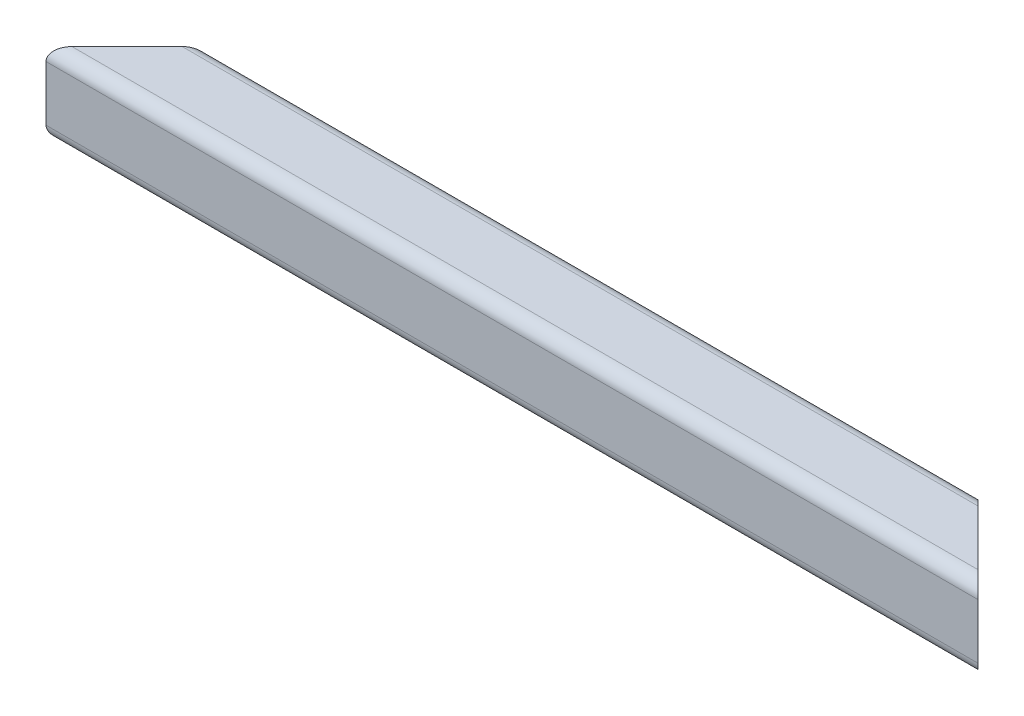
ISO-10303-21;
HEADER;
FILE_DESCRIPTION(('STEP AP214'),'2;1');
FILE_NAME('part.step','',(''),(''),'','','');
FILE_SCHEMA(('AUTOMOTIVE_DESIGN { 1 0 10303 214 1 1 1 1 }'));
ENDSEC;
DATA;
#1=APPLICATION_CONTEXT('core data for automotive mechanical design processes');
#2=APPLICATION_PROTOCOL_DEFINITION('international standard','automotive_design',2000,#1);
#3=PRODUCT_CONTEXT('',#1,'mechanical');
#4=PRODUCT('Part','Part','',(#3));
#5=PRODUCT_RELATED_PRODUCT_CATEGORY('part','',(#4));
#6=PRODUCT_DEFINITION_FORMATION('','',#4);
#7=PRODUCT_DEFINITION_CONTEXT('part definition',#1,'design');
#8=PRODUCT_DEFINITION('design','',#6,#7);
#9=PRODUCT_DEFINITION_SHAPE('','',#8);
#10=(LENGTH_UNIT() NAMED_UNIT(*) SI_UNIT(.MILLI.,.METRE.));
#11=(NAMED_UNIT(*) PLANE_ANGLE_UNIT() SI_UNIT($,.RADIAN.));
#12=(NAMED_UNIT(*) SI_UNIT($,.STERADIAN.) SOLID_ANGLE_UNIT());
#13=UNCERTAINTY_MEASURE_WITH_UNIT(LENGTH_MEASURE(1.E-05),#10,'distance_accuracy_value','');
#14=(GEOMETRIC_REPRESENTATION_CONTEXT(3) GLOBAL_UNCERTAINTY_ASSIGNED_CONTEXT((#13)) GLOBAL_UNIT_ASSIGNED_CONTEXT((#10,
#11,#12)) REPRESENTATION_CONTEXT('',''));
#15=CARTESIAN_POINT('',(0.,0.,0.));
#16=DIRECTION('',(0.,0.,1.));
#17=DIRECTION('',(1.,0.,0.));
#18=AXIS2_PLACEMENT_3D('',#15,#16,#17);
#19=CARTESIAN_POINT('',(460.,13.6,-20.));
#20=DIRECTION('',(0.,0.,1.));
#21=DIRECTION('',(1.,0.,0.));
#22=AXIS2_PLACEMENT_3D('',#19,#20,#21);
#23=PLANE('',#22);
#24=DIRECTION('',(-1.,0.,0.));
#25=VECTOR('',#24,1.);
#26=CARTESIAN_POINT('',(460.,-13.6,-20.));
#27=LINE('',#26,#25);
#28=CARTESIAN_POINT('',(420.,-13.6,-20.0000000000001));
#29=VERTEX_POINT('',#28);
#30=CARTESIAN_POINT('',(40.,-13.6,-20.));
#31=VERTEX_POINT('',#30);
#32=EDGE_CURVE('E348',#29,#31,#27,.T.);
#33=ORIENTED_EDGE('',*,*,#32,.T.);
#34=DIRECTION('',(0.,1.,0.));
#35=VECTOR('',#34,1.);
#36=CARTESIAN_POINT('',(40.,-20.,-20.));
#37=LINE('',#36,#35);
#38=CARTESIAN_POINT('',(40.,13.6,-20.));
#39=VERTEX_POINT('',#38);
#40=EDGE_CURVE('E235',#31,#39,#37,.T.);
#41=ORIENTED_EDGE('',*,*,#40,.T.);
#42=DIRECTION('',(-1.,0.,0.));
#43=VECTOR('',#42,1.);
#44=CARTESIAN_POINT('',(460.,13.6,-20.));
#45=LINE('',#44,#43);
#46=CARTESIAN_POINT('',(420.,13.6,-20.0000000000001));
#47=VERTEX_POINT('',#46);
#48=EDGE_CURVE('E344',#47,#39,#45,.T.);
#49=ORIENTED_EDGE('',*,*,#48,.F.);
#50=DIRECTION('',(0.,1.,0.));
#51=VECTOR('',#50,1.);
#52=CARTESIAN_POINT('',(420.,-20.,-20.0000000000001));
#53=LINE('',#52,#51);
#54=EDGE_CURVE('E236',#29,#47,#53,.T.);
#55=ORIENTED_EDGE('',*,*,#54,.F.);
#56=EDGE_LOOP('',(#33,#41,#49,#55));
#57=FACE_BOUND('',#56,.T.);
#58=ADVANCED_FACE('F69',(#57),#23,.F.);
#59=CARTESIAN_POINT('',(460.,-13.6,-13.6));
#60=DIRECTION('',(-1.,0.,0.));
#61=DIRECTION('',(0.,0.,1.));
#62=AXIS2_PLACEMENT_3D('',#59,#60,#61);
#63=CYLINDRICAL_SURFACE('',#62,6.4);
#64=DIRECTION('',(-1.,0.,0.));
#65=VECTOR('',#64,1.);
#66=CARTESIAN_POINT('',(460.,-20.,-13.6));
#67=LINE('',#66,#65);
#68=CARTESIAN_POINT('',(426.4,-20.,-13.6));
#69=VERTEX_POINT('',#68);
#70=CARTESIAN_POINT('',(33.6,-20.,-13.6));
#71=VERTEX_POINT('',#70);
#72=EDGE_CURVE('E353',#69,#71,#67,.T.);
#73=ORIENTED_EDGE('',*,*,#72,.T.);
#74=CARTESIAN_POINT('',(33.6000000000001,-13.6,-13.6));
#75=DIRECTION('',(0.707106781186547,0.,0.707106781186548));
#76=DIRECTION('',(-0.707106781186548,0.,0.707106781186547));
#77=AXIS2_PLACEMENT_3D('',#74,#75,#76);
#78=ELLIPSE('',#77,9.05096679918782,6.4);
#79=EDGE_CURVE('E228',#71,#31,#78,.T.);
#80=ORIENTED_EDGE('',*,*,#79,.T.);
#81=ORIENTED_EDGE('',*,*,#32,.F.);
#82=CARTESIAN_POINT('',(426.4,-13.6,-13.6));
#83=DIRECTION('',(-0.70710678118655,0.,0.707106781186545));
#84=DIRECTION('',(-0.707106781186545,0.,-0.70710678118655));
#85=AXIS2_PLACEMENT_3D('',#82,#83,#84);
#86=ELLIPSE('',#85,9.05096679918778,6.4);
#87=EDGE_CURVE('E320',#29,#69,#86,.T.);
#88=ORIENTED_EDGE('',*,*,#87,.T.);
#89=EDGE_LOOP('',(#73,#80,#81,#88));
#90=FACE_BOUND('',#89,.T.);
#91=ADVANCED_FACE('F451',(#90),#63,.T.);
#92=CARTESIAN_POINT('',(460.,-20.,13.6));
#93=DIRECTION('',(0.,1.,0.));
#94=DIRECTION('',(0.,0.,1.));
#95=AXIS2_PLACEMENT_3D('',#92,#93,#94);
#96=PLANE('',#95);
#97=CARTESIAN_POINT('',(230.,-20.,0.));
#98=DIRECTION('',(0.,1.,0.));
#99=DIRECTION('',(0.,0.,1.));
#100=AXIS2_PLACEMENT_3D('',#97,#98,#99);
#101=CIRCLE('',#100,2.);
#102=CARTESIAN_POINT('',(230.,-20.,2.));
#103=VERTEX_POINT('',#102);
#104=EDGE_CURVE('E224',#103,#103,#101,.T.);
#105=ORIENTED_EDGE('',*,*,#104,.T.);
#106=EDGE_LOOP('',(#105));
#107=FACE_BOUND('',#106,.T.);
#108=DIRECTION('',(0.707106781186545,0.,0.70710678118655));
#109=VECTOR('',#108,1.);
#110=CARTESIAN_POINT('',(420.,-20.,-20.0000000000001));
#111=LINE('',#110,#109);
#112=CARTESIAN_POINT('',(438.585786437627,-20.,-1.41421356237311));
#113=VERTEX_POINT('',#112);
#114=EDGE_CURVE('E246',#69,#113,#111,.T.);
#115=ORIENTED_EDGE('',*,*,#114,.T.);
#116=CARTESIAN_POINT('',(440.,-20.,0.));
#117=DIRECTION('',(0.,1.,0.));
#118=DIRECTION('',(0.,0.,1.));
#119=AXIS2_PLACEMENT_3D('',#116,#117,#118);
#120=CIRCLE('',#119,2.);
#121=CARTESIAN_POINT('',(441.414213562373,-20.,1.41421356237308));
#122=VERTEX_POINT('',#121);
#123=EDGE_CURVE('E416',#113,#122,#120,.T.);
#124=ORIENTED_EDGE('',*,*,#123,.T.);
#125=CARTESIAN_POINT('',(453.6,-20.,13.6));
#126=VERTEX_POINT('',#125);
#127=EDGE_CURVE('E249',#122,#126,#111,.T.);
#128=ORIENTED_EDGE('',*,*,#127,.T.);
#129=DIRECTION('',(-1.,0.,0.));
#130=VECTOR('',#129,1.);
#131=CARTESIAN_POINT('',(460.,-20.,13.6));
#132=LINE('',#131,#130);
#133=CARTESIAN_POINT('',(6.4,-20.,13.6));
#134=VERTEX_POINT('',#133);
#135=EDGE_CURVE('E356',#126,#134,#132,.T.);
#136=ORIENTED_EDGE('',*,*,#135,.T.);
#137=DIRECTION('',(0.707106781186548,0.,-0.707106781186547));
#138=VECTOR('',#137,1.);
#139=CARTESIAN_POINT('',(40.,-20.,-20.));
#140=LINE('',#139,#138);
#141=CARTESIAN_POINT('',(18.5857864376269,-20.,1.41421356237311));
#142=VERTEX_POINT('',#141);
#143=EDGE_CURVE('E222',#134,#142,#140,.T.);
#144=ORIENTED_EDGE('',*,*,#143,.T.);
#145=CARTESIAN_POINT('',(20.,-20.,0.));
#146=DIRECTION('',(0.,1.,0.));
#147=DIRECTION('',(0.,0.,1.));
#148=AXIS2_PLACEMENT_3D('',#145,#146,#147);
#149=CIRCLE('',#148,2.);
#150=CARTESIAN_POINT('',(21.4142135623731,-20.,-1.41421356237308));
#151=VERTEX_POINT('',#150);
#152=EDGE_CURVE('E207',#142,#151,#149,.T.);
#153=ORIENTED_EDGE('',*,*,#152,.T.);
#154=EDGE_CURVE('E219',#151,#71,#140,.T.);
#155=ORIENTED_EDGE('',*,*,#154,.T.);
#156=ORIENTED_EDGE('',*,*,#72,.F.);
#157=EDGE_LOOP('',(#115,#124,#128,#136,#144,#153,#155,#156));
#158=FACE_BOUND('',#157,.T.);
#159=ADVANCED_FACE('F217',(#107,#158),#96,.F.);
#160=CARTESIAN_POINT('',(460.,-13.6,20.));
#161=DIRECTION('',(0.,0.,-1.));
#162=DIRECTION('',(0.,1.,0.));
#163=AXIS2_PLACEMENT_3D('',#160,#161,#162);
#164=PLANE('',#163);
#165=DIRECTION('',(0.,-1.,0.));
#166=VECTOR('',#165,1.);
#167=CARTESIAN_POINT('',(0.,-13.6,20.));
#168=LINE('',#167,#166);
#169=CARTESIAN_POINT('',(0.,13.6,20.));
#170=VERTEX_POINT('',#169);
#171=CARTESIAN_POINT('',(0.,-13.6,20.));
#172=VERTEX_POINT('',#171);
#173=EDGE_CURVE('E336',#170,#172,#168,.T.);
#174=ORIENTED_EDGE('',*,*,#173,.T.);
#175=DIRECTION('',(-1.,0.,0.));
#176=VECTOR('',#175,1.);
#177=CARTESIAN_POINT('',(460.,-13.6,20.));
#178=LINE('',#177,#176);
#179=CARTESIAN_POINT('',(460.,-13.6,20.0000000000002));
#180=VERTEX_POINT('',#179);
#181=EDGE_CURVE('E359',#180,#172,#178,.T.);
#182=ORIENTED_EDGE('',*,*,#181,.F.);
#183=DIRECTION('',(0.,-1.,0.));
#184=VECTOR('',#183,1.);
#185=CARTESIAN_POINT('',(460.,-13.6,20.));
#186=LINE('',#185,#184);
#187=CARTESIAN_POINT('',(460.,13.6,20.));
#188=VERTEX_POINT('',#187);
#189=EDGE_CURVE('E337',#188,#180,#186,.T.);
#190=ORIENTED_EDGE('',*,*,#189,.F.);
#191=DIRECTION('',(-1.,0.,0.));
#192=VECTOR('',#191,1.);
#193=CARTESIAN_POINT('',(460.,13.6,20.));
#194=LINE('',#193,#192);
#195=EDGE_CURVE('E363',#188,#170,#194,.T.);
#196=ORIENTED_EDGE('',*,*,#195,.T.);
#197=EDGE_LOOP('',(#174,#182,#190,#196));
#198=FACE_BOUND('',#197,.T.);
#199=ADVANCED_FACE('F434',(#198),#164,.F.);
#200=CARTESIAN_POINT('',(460.,-13.6,13.6));
#201=DIRECTION('',(-1.,0.,0.));
#202=DIRECTION('',(0.,0.,1.));
#203=AXIS2_PLACEMENT_3D('',#200,#201,#202);
#204=CYLINDRICAL_SURFACE('',#203,6.4);
#205=ORIENTED_EDGE('',*,*,#181,.T.);
#206=CARTESIAN_POINT('',(6.40000000000007,-13.6,13.6));
#207=DIRECTION('',(0.707106781186547,0.,0.707106781186548));
#208=DIRECTION('',(-0.707106781186548,0.,0.707106781186547));
#209=AXIS2_PLACEMENT_3D('',#206,#207,#208);
#210=ELLIPSE('',#209,9.05096679918781,6.4);
#211=EDGE_CURVE('E282',#172,#134,#210,.T.);
#212=ORIENTED_EDGE('',*,*,#211,.T.);
#213=ORIENTED_EDGE('',*,*,#135,.F.);
#214=CARTESIAN_POINT('',(453.6,-13.6,13.6));
#215=DIRECTION('',(-0.70710678118655,0.,0.707106781186545));
#216=DIRECTION('',(-0.707106781186545,0.,-0.70710678118655));
#217=AXIS2_PLACEMENT_3D('',#214,#215,#216);
#218=ELLIPSE('',#217,9.05096679918778,6.4);
#219=EDGE_CURVE('E324',#126,#180,#218,.T.);
#220=ORIENTED_EDGE('',*,*,#219,.T.);
#221=EDGE_LOOP('',(#205,#212,#213,#220));
#222=FACE_BOUND('',#221,.T.);
#223=ADVANCED_FACE('F432',(#222),#204,.T.);
#224=CARTESIAN_POINT('',(460.,13.6,13.6));
#225=DIRECTION('',(-1.,0.,0.));
#226=DIRECTION('',(0.,0.,1.));
#227=AXIS2_PLACEMENT_3D('',#224,#225,#226);
#228=CYLINDRICAL_SURFACE('',#227,6.4);
#229=DIRECTION('',(-1.,0.,0.));
#230=VECTOR('',#229,1.);
#231=CARTESIAN_POINT('',(460.,20.,13.6));
#232=LINE('',#231,#230);
#233=CARTESIAN_POINT('',(453.6,20.,13.6));
#234=VERTEX_POINT('',#233);
#235=CARTESIAN_POINT('',(6.40000000000001,20.,13.6));
#236=VERTEX_POINT('',#235);
#237=EDGE_CURVE('E367',#234,#236,#232,.T.);
#238=ORIENTED_EDGE('',*,*,#237,.T.);
#239=CARTESIAN_POINT('',(6.40000000000007,13.6,13.6));
#240=DIRECTION('',(0.707106781186547,0.,0.707106781186548));
#241=DIRECTION('',(-0.707106781186548,0.,0.707106781186547));
#242=AXIS2_PLACEMENT_3D('',#239,#240,#241);
#243=ELLIPSE('',#242,9.05096679918782,6.4);
#244=EDGE_CURVE('E286',#236,#170,#243,.T.);
#245=ORIENTED_EDGE('',*,*,#244,.T.);
#246=ORIENTED_EDGE('',*,*,#195,.F.);
#247=CARTESIAN_POINT('',(453.6,13.6,13.6));
#248=DIRECTION('',(-0.70710678118655,0.,0.707106781186545));
#249=DIRECTION('',(-0.707106781186545,0.,-0.70710678118655));
#250=AXIS2_PLACEMENT_3D('',#247,#248,#249);
#251=ELLIPSE('',#250,9.05096679918778,6.4);
#252=EDGE_CURVE('E328',#188,#234,#251,.T.);
#253=ORIENTED_EDGE('',*,*,#252,.T.);
#254=EDGE_LOOP('',(#238,#245,#246,#253));
#255=FACE_BOUND('',#254,.T.);
#256=ADVANCED_FACE('F437',(#255),#228,.T.);
#257=CARTESIAN_POINT('',(460.,20.,-13.6));
#258=DIRECTION('',(0.,-1.,0.));
#259=DIRECTION('',(0.,0.,-1.));
#260=AXIS2_PLACEMENT_3D('',#257,#258,#259);
#261=PLANE('',#260);
#262=DIRECTION('',(-1.,0.,0.));
#263=VECTOR('',#262,1.);
#264=CARTESIAN_POINT('',(460.,20.,-13.6));
#265=LINE('',#264,#263);
#266=CARTESIAN_POINT('',(426.4,20.,-13.6));
#267=VERTEX_POINT('',#266);
#268=CARTESIAN_POINT('',(33.6,20.,-13.6));
#269=VERTEX_POINT('',#268);
#270=EDGE_CURVE('E371',#267,#269,#265,.T.);
#271=ORIENTED_EDGE('',*,*,#270,.T.);
#272=DIRECTION('',(0.707106781186548,0.,-0.707106781186547));
#273=VECTOR('',#272,1.);
#274=CARTESIAN_POINT('',(40.,20.,-20.));
#275=LINE('',#274,#273);
#276=EDGE_CURVE('E231',#236,#269,#275,.T.);
#277=ORIENTED_EDGE('',*,*,#276,.F.);
#278=ORIENTED_EDGE('',*,*,#237,.F.);
#279=DIRECTION('',(0.707106781186545,0.,0.70710678118655));
#280=VECTOR('',#279,1.);
#281=CARTESIAN_POINT('',(420.,20.,-20.0000000000001));
#282=LINE('',#281,#280);
#283=EDGE_CURVE('E250',#267,#234,#282,.T.);
#284=ORIENTED_EDGE('',*,*,#283,.F.);
#285=EDGE_LOOP('',(#271,#277,#278,#284));
#286=FACE_BOUND('',#285,.T.);
#287=ADVANCED_FACE('F441',(#286),#261,.F.);
#288=CARTESIAN_POINT('',(460.,13.6,-13.6));
#289=DIRECTION('',(-1.,0.,0.));
#290=DIRECTION('',(0.,0.,1.));
#291=AXIS2_PLACEMENT_3D('',#288,#289,#290);
#292=CYLINDRICAL_SURFACE('',#291,6.4);
#293=ORIENTED_EDGE('',*,*,#48,.T.);
#294=CARTESIAN_POINT('',(33.6000000000001,13.6,-13.6));
#295=DIRECTION('',(0.707106781186547,0.,0.707106781186548));
#296=DIRECTION('',(-0.707106781186548,0.,0.707106781186547));
#297=AXIS2_PLACEMENT_3D('',#294,#295,#296);
#298=ELLIPSE('',#297,9.05096679918782,6.4);
#299=EDGE_CURVE('E290',#39,#269,#298,.T.);
#300=ORIENTED_EDGE('',*,*,#299,.T.);
#301=ORIENTED_EDGE('',*,*,#270,.F.);
#302=CARTESIAN_POINT('',(426.4,13.6,-13.6));
#303=DIRECTION('',(-0.70710678118655,0.,0.707106781186545));
#304=DIRECTION('',(-0.707106781186545,0.,-0.70710678118655));
#305=AXIS2_PLACEMENT_3D('',#302,#303,#304);
#306=ELLIPSE('',#305,9.05096679918778,6.4);
#307=EDGE_CURVE('E332',#267,#47,#306,.T.);
#308=ORIENTED_EDGE('',*,*,#307,.T.);
#309=EDGE_LOOP('',(#293,#300,#301,#308));
#310=FACE_BOUND('',#309,.T.);
#311=ADVANCED_FACE('F445',(#310),#292,.T.);
#312=CARTESIAN_POINT('',(40.,-20.,-20.));
#313=DIRECTION('',(0.707106781186547,0.,0.707106781186548));
#314=DIRECTION('',(0.707106781186548,0.,-0.707106781186547));
#315=AXIS2_PLACEMENT_3D('',#312,#313,#314);
#316=PLANE('',#315);
#317=ORIENTED_EDGE('',*,*,#154,.F.);
#318=DIRECTION('',(0.,1.,0.));
#319=VECTOR('',#318,1.);
#320=CARTESIAN_POINT('',(21.4142135623731,-20.,-1.41421356237308));
#321=LINE('',#320,#319);
#322=CARTESIAN_POINT('',(21.4142135623731,-16.8,-1.41421356237308));
#323=VERTEX_POINT('',#322);
#324=EDGE_CURVE('E204',#151,#323,#321,.T.);
#325=ORIENTED_EDGE('',*,*,#324,.T.);
#326=DIRECTION('',(0.707106781186548,0.,-0.707106781186547));
#327=VECTOR('',#326,1.);
#328=CARTESIAN_POINT('',(233.2,-16.8,-213.2));
#329=LINE('',#328,#327);
#330=CARTESIAN_POINT('',(33.6,-16.8,-13.6));
#331=VERTEX_POINT('',#330);
#332=EDGE_CURVE('E260',#323,#331,#329,.T.);
#333=ORIENTED_EDGE('',*,*,#332,.T.);
#334=CARTESIAN_POINT('',(33.6000000000001,-13.6,-13.6));
#335=DIRECTION('',(0.707106781186547,0.,0.707106781186548));
#336=DIRECTION('',(-0.707106781186548,0.,0.707106781186547));
#337=AXIS2_PLACEMENT_3D('',#334,#335,#336);
#338=ELLIPSE('',#337,4.5254833995939,3.2);
#339=CARTESIAN_POINT('',(36.8000000000001,-13.6,-16.8));
#340=VERTEX_POINT('',#339);
#341=EDGE_CURVE('E265',#331,#340,#338,.T.);
#342=ORIENTED_EDGE('',*,*,#341,.T.);
#343=DIRECTION('',(0.,1.,0.));
#344=VECTOR('',#343,1.);
#345=CARTESIAN_POINT('',(36.8000000000001,13.6000000000001,-16.8));
#346=LINE('',#345,#344);
#347=CARTESIAN_POINT('',(36.8000000000001,13.6,-16.8));
#348=VERTEX_POINT('',#347);
#349=EDGE_CURVE('E268',#340,#348,#346,.T.);
#350=ORIENTED_EDGE('',*,*,#349,.T.);
#351=CARTESIAN_POINT('',(33.6000000000001,13.6,-13.6));
#352=DIRECTION('',(0.707106781186547,0.,0.707106781186548));
#353=DIRECTION('',(-0.707106781186548,0.,0.707106781186547));
#354=AXIS2_PLACEMENT_3D('',#351,#352,#353);
#355=ELLIPSE('',#354,4.5254833995939,3.2);
#356=CARTESIAN_POINT('',(33.6000000000001,16.8,-13.6));
#357=VERTEX_POINT('',#356);
#358=EDGE_CURVE('E271',#348,#357,#355,.T.);
#359=ORIENTED_EDGE('',*,*,#358,.T.);
#360=DIRECTION('',(-0.707106781186548,0.,0.707106781186547));
#361=VECTOR('',#360,1.);
#362=CARTESIAN_POINT('',(246.8,16.8,-226.8));
#363=LINE('',#362,#361);
#364=CARTESIAN_POINT('',(6.40000000000002,16.8,13.6));
#365=VERTEX_POINT('',#364);
#366=EDGE_CURVE('E274',#357,#365,#363,.T.);
#367=ORIENTED_EDGE('',*,*,#366,.T.);
#368=CARTESIAN_POINT('',(6.40000000000007,13.6,13.6));
#369=DIRECTION('',(0.707106781186547,0.,0.707106781186548));
#370=DIRECTION('',(-0.707106781186548,0.,0.707106781186547));
#371=AXIS2_PLACEMENT_3D('',#368,#369,#370);
#372=ELLIPSE('',#371,4.52548339959391,3.2);
#373=CARTESIAN_POINT('',(3.20000000000004,13.6,16.8));
#374=VERTEX_POINT('',#373);
#375=EDGE_CURVE('E277',#365,#374,#372,.T.);
#376=ORIENTED_EDGE('',*,*,#375,.T.);
#377=DIRECTION('',(0.,-1.,0.));
#378=VECTOR('',#377,1.);
#379=CARTESIAN_POINT('',(3.20000000000004,-13.6000000000001,16.8));
#380=LINE('',#379,#378);
#381=CARTESIAN_POINT('',(3.20000000000004,-13.6,16.8));
#382=VERTEX_POINT('',#381);
#383=EDGE_CURVE('E245',#374,#382,#380,.T.);
#384=ORIENTED_EDGE('',*,*,#383,.T.);
#385=CARTESIAN_POINT('',(6.40000000000007,-13.6,13.6));
#386=DIRECTION('',(0.707106781186547,0.,0.707106781186548));
#387=DIRECTION('',(-0.707106781186548,0.,0.707106781186547));
#388=AXIS2_PLACEMENT_3D('',#385,#386,#387);
#389=ELLIPSE('',#388,4.5254833995939,3.2);
#390=CARTESIAN_POINT('',(6.40000000000007,-16.8,13.6));
#391=VERTEX_POINT('',#390);
#392=EDGE_CURVE('E257',#382,#391,#389,.T.);
#393=ORIENTED_EDGE('',*,*,#392,.T.);
#394=CARTESIAN_POINT('',(18.5857864376269,-16.8,1.41421356237311));
#395=VERTEX_POINT('',#394);
#396=EDGE_CURVE('E261',#391,#395,#329,.T.);
#397=ORIENTED_EDGE('',*,*,#396,.T.);
#398=DIRECTION('',(0.,1.,0.));
#399=VECTOR('',#398,1.);
#400=CARTESIAN_POINT('',(18.5857864376269,-20.,1.41421356237311));
#401=LINE('',#400,#399);
#402=EDGE_CURVE('E92',#395,#142,#401,.F.);
#403=ORIENTED_EDGE('',*,*,#402,.T.);
#404=ORIENTED_EDGE('',*,*,#143,.F.);
#405=ORIENTED_EDGE('',*,*,#211,.F.);
#406=ORIENTED_EDGE('',*,*,#173,.F.);
#407=ORIENTED_EDGE('',*,*,#244,.F.);
#408=ORIENTED_EDGE('',*,*,#276,.T.);
#409=ORIENTED_EDGE('',*,*,#299,.F.);
#410=ORIENTED_EDGE('',*,*,#40,.F.);
#411=ORIENTED_EDGE('',*,*,#79,.F.);
#412=EDGE_LOOP('',(#317,#325,#333,#342,#350,#359,#367,#376,#384,#393,#397,#403,#404,#405,#406,
#407,#408,#409,#410,#411));
#413=FACE_BOUND('',#412,.T.);
#414=ADVANCED_FACE('F226',(#413),#316,.F.);
#415=CARTESIAN_POINT('',(420.,-20.,-20.0000000000001));
#416=DIRECTION('',(-0.70710678118655,0.,0.707106781186545));
#417=DIRECTION('',(0.707106781186545,0.,0.70710678118655));
#418=AXIS2_PLACEMENT_3D('',#415,#416,#417);
#419=PLANE('',#418);
#420=ORIENTED_EDGE('',*,*,#127,.F.);
#421=DIRECTION('',(0.,1.,0.));
#422=VECTOR('',#421,1.);
#423=CARTESIAN_POINT('',(441.414213562373,-20.,1.41421356237308));
#424=LINE('',#423,#422);
#425=CARTESIAN_POINT('',(441.414213562373,-16.8,1.41421356237308));
#426=VERTEX_POINT('',#425);
#427=EDGE_CURVE('E239',#122,#426,#424,.T.);
#428=ORIENTED_EDGE('',*,*,#427,.T.);
#429=DIRECTION('',(0.707106781186545,0.,0.70710678118655));
#430=VECTOR('',#429,1.);
#431=CARTESIAN_POINT('',(456.8,-16.8,16.8000000000001));
#432=LINE('',#431,#430);
#433=CARTESIAN_POINT('',(453.6,-16.8,13.6));
#434=VERTEX_POINT('',#433);
#435=EDGE_CURVE('E300',#426,#434,#432,.T.);
#436=ORIENTED_EDGE('',*,*,#435,.T.);
#437=CARTESIAN_POINT('',(453.6,-13.6,13.6));
#438=DIRECTION('',(-0.70710678118655,0.,0.707106781186545));
#439=DIRECTION('',(-0.707106781186545,0.,-0.70710678118655));
#440=AXIS2_PLACEMENT_3D('',#437,#438,#439);
#441=ELLIPSE('',#440,4.52548339959389,3.2);
#442=CARTESIAN_POINT('',(456.8,-13.6,16.8));
#443=VERTEX_POINT('',#442);
#444=EDGE_CURVE('E297',#434,#443,#441,.T.);
#445=ORIENTED_EDGE('',*,*,#444,.T.);
#446=DIRECTION('',(0.,1.,0.));
#447=VECTOR('',#446,1.);
#448=CARTESIAN_POINT('',(456.8,-13.6,16.8));
#449=LINE('',#448,#447);
#450=CARTESIAN_POINT('',(456.8,13.6,16.8));
#451=VERTEX_POINT('',#450);
#452=EDGE_CURVE('E294',#443,#451,#449,.T.);
#453=ORIENTED_EDGE('',*,*,#452,.T.);
#454=CARTESIAN_POINT('',(453.6,13.6,13.6));
#455=DIRECTION('',(-0.70710678118655,0.,0.707106781186545));
#456=DIRECTION('',(-0.707106781186545,0.,-0.70710678118655));
#457=AXIS2_PLACEMENT_3D('',#454,#455,#456);
#458=ELLIPSE('',#457,4.52548339959389,3.2);
#459=CARTESIAN_POINT('',(453.6,16.8,13.6));
#460=VERTEX_POINT('',#459);
#461=EDGE_CURVE('E317',#451,#460,#458,.T.);
#462=ORIENTED_EDGE('',*,*,#461,.T.);
#463=DIRECTION('',(-0.707106781186545,0.,-0.70710678118655));
#464=VECTOR('',#463,1.);
#465=CARTESIAN_POINT('',(443.2,16.8,3.19999999999998));
#466=LINE('',#465,#464);
#467=CARTESIAN_POINT('',(426.4,16.8,-13.6));
#468=VERTEX_POINT('',#467);
#469=EDGE_CURVE('E314',#460,#468,#466,.T.);
#470=ORIENTED_EDGE('',*,*,#469,.T.);
#471=CARTESIAN_POINT('',(426.4,13.6,-13.6));
#472=DIRECTION('',(-0.70710678118655,0.,0.707106781186545));
#473=DIRECTION('',(-0.707106781186545,0.,-0.70710678118655));
#474=AXIS2_PLACEMENT_3D('',#471,#472,#473);
#475=ELLIPSE('',#474,4.52548339959389,3.2);
#476=CARTESIAN_POINT('',(423.2,13.6,-16.8));
#477=VERTEX_POINT('',#476);
#478=EDGE_CURVE('E311',#468,#477,#475,.T.);
#479=ORIENTED_EDGE('',*,*,#478,.T.);
#480=DIRECTION('',(0.,-1.,0.));
#481=VECTOR('',#480,1.);
#482=CARTESIAN_POINT('',(423.2,13.6,-16.8));
#483=LINE('',#482,#481);
#484=CARTESIAN_POINT('',(423.2,-13.6,-16.8));
#485=VERTEX_POINT('',#484);
#486=EDGE_CURVE('E308',#477,#485,#483,.T.);
#487=ORIENTED_EDGE('',*,*,#486,.T.);
#488=CARTESIAN_POINT('',(426.4,-13.6,-13.6));
#489=DIRECTION('',(-0.70710678118655,0.,0.707106781186545));
#490=DIRECTION('',(-0.707106781186545,0.,-0.70710678118655));
#491=AXIS2_PLACEMENT_3D('',#488,#489,#490);
#492=ELLIPSE('',#491,4.52548339959389,3.2);
#493=CARTESIAN_POINT('',(426.4,-16.8,-13.6));
#494=VERTEX_POINT('',#493);
#495=EDGE_CURVE('E305',#485,#494,#492,.T.);
#496=ORIENTED_EDGE('',*,*,#495,.T.);
#497=CARTESIAN_POINT('',(438.585786437627,-16.8,-1.41421356237312));
#498=VERTEX_POINT('',#497);
#499=EDGE_CURVE('E301',#494,#498,#432,.T.);
#500=ORIENTED_EDGE('',*,*,#499,.T.);
#501=DIRECTION('',(0.,1.,0.));
#502=VECTOR('',#501,1.);
#503=CARTESIAN_POINT('',(438.585786437627,-20.,-1.41421356237311));
#504=LINE('',#503,#502);
#505=EDGE_CURVE('E84',#498,#113,#504,.F.);
#506=ORIENTED_EDGE('',*,*,#505,.T.);
#507=ORIENTED_EDGE('',*,*,#114,.F.);
#508=ORIENTED_EDGE('',*,*,#87,.F.);
#509=ORIENTED_EDGE('',*,*,#54,.T.);
#510=ORIENTED_EDGE('',*,*,#307,.F.);
#511=ORIENTED_EDGE('',*,*,#283,.T.);
#512=ORIENTED_EDGE('',*,*,#252,.F.);
#513=ORIENTED_EDGE('',*,*,#189,.T.);
#514=ORIENTED_EDGE('',*,*,#219,.F.);
#515=EDGE_LOOP('',(#420,#428,#436,#445,#453,#462,#470,#479,#487,#496,#500,#506,#507,#508,#509,
#510,#511,#512,#513,#514));
#516=FACE_BOUND('',#515,.T.);
#517=ADVANCED_FACE('F425',(#516),#419,.F.);
#518=CARTESIAN_POINT('',(460.,13.6,13.6));
#519=DIRECTION('',(-1.,0.,0.));
#520=DIRECTION('',(0.,0.,1.));
#521=AXIS2_PLACEMENT_3D('',#518,#519,#520);
#522=CYLINDRICAL_SURFACE('',#521,3.2);
#523=ORIENTED_EDGE('',*,*,#375,.F.);
#524=DIRECTION('',(-1.,0.,0.));
#525=VECTOR('',#524,1.);
#526=CARTESIAN_POINT('',(460.,16.8,13.6));
#527=LINE('',#526,#525);
#528=EDGE_CURVE('E349',#460,#365,#527,.T.);
#529=ORIENTED_EDGE('',*,*,#528,.F.);
#530=ORIENTED_EDGE('',*,*,#461,.F.);
#531=DIRECTION('',(-1.,0.,0.));
#532=VECTOR('',#531,1.);
#533=CARTESIAN_POINT('',(460.,13.6,16.8));
#534=LINE('',#533,#532);
#535=EDGE_CURVE('E340',#451,#374,#534,.T.);
#536=ORIENTED_EDGE('',*,*,#535,.T.);
#537=EDGE_LOOP('',(#523,#529,#530,#536));
#538=FACE_BOUND('',#537,.T.);
#539=ADVANCED_FACE('F71',(#538),#522,.F.);
#540=CARTESIAN_POINT('',(460.,16.8,-13.6));
#541=DIRECTION('',(0.,-1.,0.));
#542=DIRECTION('',(0.,0.,-1.));
#543=AXIS2_PLACEMENT_3D('',#540,#541,#542);
#544=PLANE('',#543);
#545=ORIENTED_EDGE('',*,*,#366,.F.);
#546=DIRECTION('',(-1.,0.,0.));
#547=VECTOR('',#546,1.);
#548=CARTESIAN_POINT('',(460.,16.8,-13.6));
#549=LINE('',#548,#547);
#550=EDGE_CURVE('E398',#468,#357,#549,.T.);
#551=ORIENTED_EDGE('',*,*,#550,.F.);
#552=ORIENTED_EDGE('',*,*,#469,.F.);
#553=ORIENTED_EDGE('',*,*,#528,.T.);
#554=EDGE_LOOP('',(#545,#551,#552,#553));
#555=FACE_BOUND('',#554,.T.);
#556=ADVANCED_FACE('F495',(#555),#544,.T.);
#557=CARTESIAN_POINT('',(460.,13.6,-13.6));
#558=DIRECTION('',(-1.,0.,0.));
#559=DIRECTION('',(0.,0.,1.));
#560=AXIS2_PLACEMENT_3D('',#557,#558,#559);
#561=CYLINDRICAL_SURFACE('',#560,3.2);
#562=ORIENTED_EDGE('',*,*,#358,.F.);
#563=DIRECTION('',(-1.,0.,0.));
#564=VECTOR('',#563,1.);
#565=CARTESIAN_POINT('',(460.,13.6,-16.8));
#566=LINE('',#565,#564);
#567=EDGE_CURVE('E394',#477,#348,#566,.T.);
#568=ORIENTED_EDGE('',*,*,#567,.F.);
#569=ORIENTED_EDGE('',*,*,#478,.F.);
#570=ORIENTED_EDGE('',*,*,#550,.T.);
#571=EDGE_LOOP('',(#562,#568,#569,#570));
#572=FACE_BOUND('',#571,.T.);
#573=ADVANCED_FACE('F492',(#572),#561,.F.);
#574=CARTESIAN_POINT('',(460.,13.6,-16.8));
#575=DIRECTION('',(0.,0.,1.));
#576=DIRECTION('',(1.,0.,0.));
#577=AXIS2_PLACEMENT_3D('',#574,#575,#576);
#578=PLANE('',#577);
#579=ORIENTED_EDGE('',*,*,#349,.F.);
#580=DIRECTION('',(-1.,0.,0.));
#581=VECTOR('',#580,1.);
#582=CARTESIAN_POINT('',(460.,-13.6,-16.8));
#583=LINE('',#582,#581);
#584=EDGE_CURVE('E390',#485,#340,#583,.T.);
#585=ORIENTED_EDGE('',*,*,#584,.F.);
#586=ORIENTED_EDGE('',*,*,#486,.F.);
#587=ORIENTED_EDGE('',*,*,#567,.T.);
#588=EDGE_LOOP('',(#579,#585,#586,#587));
#589=FACE_BOUND('',#588,.T.);
#590=ADVANCED_FACE('F488',(#589),#578,.T.);
#591=CARTESIAN_POINT('',(460.,-13.6,-13.6));
#592=DIRECTION('',(-1.,0.,0.));
#593=DIRECTION('',(0.,0.,1.));
#594=AXIS2_PLACEMENT_3D('',#591,#592,#593);
#595=CYLINDRICAL_SURFACE('',#594,3.2);
#596=ORIENTED_EDGE('',*,*,#341,.F.);
#597=DIRECTION('',(-1.,0.,0.));
#598=VECTOR('',#597,1.);
#599=CARTESIAN_POINT('',(460.,-16.8,-13.6));
#600=LINE('',#599,#598);
#601=EDGE_CURVE('E386',#494,#331,#600,.T.);
#602=ORIENTED_EDGE('',*,*,#601,.F.);
#603=ORIENTED_EDGE('',*,*,#495,.F.);
#604=ORIENTED_EDGE('',*,*,#584,.T.);
#605=EDGE_LOOP('',(#596,#602,#603,#604));
#606=FACE_BOUND('',#605,.T.);
#607=ADVANCED_FACE('F484',(#606),#595,.F.);
#608=CARTESIAN_POINT('',(460.,-16.8,13.6));
#609=DIRECTION('',(0.,1.,0.));
#610=DIRECTION('',(0.,0.,1.));
#611=AXIS2_PLACEMENT_3D('',#608,#609,#610);
#612=PLANE('',#611);
#613=CARTESIAN_POINT('',(440.,-16.8,0.));
#614=DIRECTION('',(0.,1.,0.));
#615=DIRECTION('',(0.,0.,1.));
#616=AXIS2_PLACEMENT_3D('',#613,#614,#615);
#617=CIRCLE('',#616,2.);
#618=EDGE_CURVE('E12',#498,#426,#617,.T.);
#619=ORIENTED_EDGE('',*,*,#618,.F.);
#620=ORIENTED_EDGE('',*,*,#499,.F.);
#621=ORIENTED_EDGE('',*,*,#601,.T.);
#622=ORIENTED_EDGE('',*,*,#332,.F.);
#623=CARTESIAN_POINT('',(20.,-16.8,0.));
#624=DIRECTION('',(0.,1.,0.));
#625=DIRECTION('',(0.,0.,1.));
#626=AXIS2_PLACEMENT_3D('',#623,#624,#625);
#627=CIRCLE('',#626,2.);
#628=EDGE_CURVE('E78',#395,#323,#627,.T.);
#629=ORIENTED_EDGE('',*,*,#628,.F.);
#630=ORIENTED_EDGE('',*,*,#396,.F.);
#631=DIRECTION('',(-1.,0.,0.));
#632=VECTOR('',#631,1.);
#633=CARTESIAN_POINT('',(460.,-16.8,13.6));
#634=LINE('',#633,#632);
#635=EDGE_CURVE('E382',#434,#391,#634,.T.);
#636=ORIENTED_EDGE('',*,*,#635,.F.);
#637=ORIENTED_EDGE('',*,*,#435,.F.);
#638=EDGE_LOOP('',(#619,#620,#621,#622,#629,#630,#636,#637));
#639=FACE_BOUND('',#638,.T.);
#640=CARTESIAN_POINT('',(230.,-16.8,0.));
#641=DIRECTION('',(0.,1.,0.));
#642=DIRECTION('',(0.,0.,1.));
#643=AXIS2_PLACEMENT_3D('',#640,#641,#642);
#644=CIRCLE('',#643,2.);
#645=CARTESIAN_POINT('',(230.,-16.8,2.));
#646=VERTEX_POINT('',#645);
#647=EDGE_CURVE('E212',#646,#646,#644,.T.);
#648=ORIENTED_EDGE('',*,*,#647,.F.);
#649=EDGE_LOOP('',(#648));
#650=FACE_BOUND('',#649,.T.);
#651=ADVANCED_FACE('F480',(#639,#650),#612,.T.);
#652=CARTESIAN_POINT('',(460.,-13.6,13.6));
#653=DIRECTION('',(-1.,0.,0.));
#654=DIRECTION('',(0.,0.,1.));
#655=AXIS2_PLACEMENT_3D('',#652,#653,#654);
#656=CYLINDRICAL_SURFACE('',#655,3.2);
#657=ORIENTED_EDGE('',*,*,#392,.F.);
#658=DIRECTION('',(-1.,0.,0.));
#659=VECTOR('',#658,1.);
#660=CARTESIAN_POINT('',(460.,-13.6,16.8));
#661=LINE('',#660,#659);
#662=EDGE_CURVE('E378',#443,#382,#661,.T.);
#663=ORIENTED_EDGE('',*,*,#662,.F.);
#664=ORIENTED_EDGE('',*,*,#444,.F.);
#665=ORIENTED_EDGE('',*,*,#635,.T.);
#666=EDGE_LOOP('',(#657,#663,#664,#665));
#667=FACE_BOUND('',#666,.T.);
#668=ADVANCED_FACE('F476',(#667),#656,.F.);
#669=CARTESIAN_POINT('',(460.,-13.6,16.8));
#670=DIRECTION('',(0.,0.,-1.));
#671=DIRECTION('',(0.,1.,0.));
#672=AXIS2_PLACEMENT_3D('',#669,#670,#671);
#673=PLANE('',#672);
#674=ORIENTED_EDGE('',*,*,#383,.F.);
#675=ORIENTED_EDGE('',*,*,#535,.F.);
#676=ORIENTED_EDGE('',*,*,#452,.F.);
#677=ORIENTED_EDGE('',*,*,#662,.T.);
#678=EDGE_LOOP('',(#674,#675,#676,#677));
#679=FACE_BOUND('',#678,.T.);
#680=ADVANCED_FACE('F473',(#679),#673,.T.);
#681=CARTESIAN_POINT('',(20.,-20.,0.));
#682=DIRECTION('',(0.,1.,0.));
#683=DIRECTION('',(0.,0.,1.));
#684=AXIS2_PLACEMENT_3D('',#681,#682,#683);
#685=CYLINDRICAL_SURFACE('',#684,2.);
#686=ORIENTED_EDGE('',*,*,#152,.F.);
#687=ORIENTED_EDGE('',*,*,#402,.F.);
#688=ORIENTED_EDGE('',*,*,#628,.T.);
#689=ORIENTED_EDGE('',*,*,#324,.F.);
#690=EDGE_LOOP('',(#686,#687,#688,#689));
#691=FACE_BOUND('',#690,.T.);
#692=ADVANCED_FACE('F206',(#691),#685,.F.);
#693=CARTESIAN_POINT('',(230.,-20.,0.));
#694=DIRECTION('',(0.,1.,0.));
#695=DIRECTION('',(0.,0.,1.));
#696=AXIS2_PLACEMENT_3D('',#693,#694,#695);
#697=CYLINDRICAL_SURFACE('',#696,2.);
#698=ORIENTED_EDGE('',*,*,#647,.T.);
#699=EDGE_LOOP('',(#698));
#700=FACE_BOUND('',#699,.T.);
#701=ORIENTED_EDGE('',*,*,#104,.F.);
#702=EDGE_LOOP('',(#701));
#703=FACE_BOUND('',#702,.T.);
#704=ADVANCED_FACE('F522',(#700,#703),#697,.F.);
#705=CARTESIAN_POINT('',(440.,-20.,0.));
#706=DIRECTION('',(0.,1.,0.));
#707=DIRECTION('',(0.,0.,1.));
#708=AXIS2_PLACEMENT_3D('',#705,#706,#707);
#709=CYLINDRICAL_SURFACE('',#708,2.);
#710=ORIENTED_EDGE('',*,*,#123,.F.);
#711=ORIENTED_EDGE('',*,*,#505,.F.);
#712=ORIENTED_EDGE('',*,*,#618,.T.);
#713=ORIENTED_EDGE('',*,*,#427,.F.);
#714=EDGE_LOOP('',(#710,#711,#712,#713));
#715=FACE_BOUND('',#714,.T.);
#716=ADVANCED_FACE('F520',(#715),#709,.F.);
#717=CLOSED_SHELL('',(#58,#91,#159,#199,#223,#256,#287,#311,#414,#517,#539,#556,#573,#590,#607,
#651,#668,#680,#692,#704,#716));
#718=MANIFOLD_SOLID_BREP('B2',#717);
#719=ADVANCED_BREP_SHAPE_REPRESENTATION('',(#18,#718),#14);
#720=SHAPE_DEFINITION_REPRESENTATION(#9,#719);
ENDSEC;
END-ISO-10303-21;
